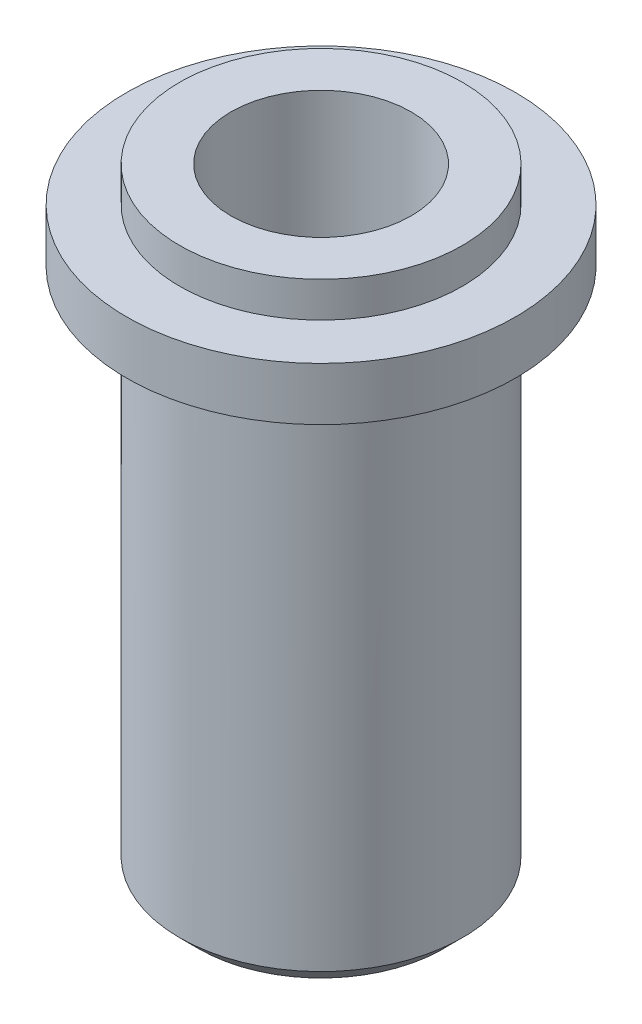
ISO-10303-21;
HEADER;
FILE_DESCRIPTION(('STEP AP214'),'2;1');
FILE_NAME('part.step','',(''),(''),'','','');
FILE_SCHEMA(('AUTOMOTIVE_DESIGN { 1 0 10303 214 1 1 1 1 }'));
ENDSEC;
DATA;
#1=APPLICATION_CONTEXT('core data for automotive mechanical design processes');
#2=APPLICATION_PROTOCOL_DEFINITION('international standard','automotive_design',2000,#1);
#3=PRODUCT_CONTEXT('',#1,'mechanical');
#4=PRODUCT('Part','Part','',(#3));
#5=PRODUCT_RELATED_PRODUCT_CATEGORY('part','',(#4));
#6=PRODUCT_DEFINITION_FORMATION('','',#4);
#7=PRODUCT_DEFINITION_CONTEXT('part definition',#1,'design');
#8=PRODUCT_DEFINITION('design','',#6,#7);
#9=PRODUCT_DEFINITION_SHAPE('','',#8);
#10=(LENGTH_UNIT() NAMED_UNIT(*) SI_UNIT(.MILLI.,.METRE.));
#11=(NAMED_UNIT(*) PLANE_ANGLE_UNIT() SI_UNIT($,.RADIAN.));
#12=(NAMED_UNIT(*) SI_UNIT($,.STERADIAN.) SOLID_ANGLE_UNIT());
#13=UNCERTAINTY_MEASURE_WITH_UNIT(LENGTH_MEASURE(1.E-05),#10,'distance_accuracy_value','');
#14=(GEOMETRIC_REPRESENTATION_CONTEXT(3) GLOBAL_UNCERTAINTY_ASSIGNED_CONTEXT((#13)) GLOBAL_UNIT_ASSIGNED_CONTEXT((#10,
#11,#12)) REPRESENTATION_CONTEXT('',''));
#15=CARTESIAN_POINT('',(0.,0.,0.));
#16=DIRECTION('',(0.,0.,1.));
#17=DIRECTION('',(1.,0.,0.));
#18=AXIS2_PLACEMENT_3D('',#15,#16,#17);
#19=CARTESIAN_POINT('',(8.,0.,0.));
#20=DIRECTION('',(0.,-1.,0.));
#21=DIRECTION('',(0.,0.,-1.));
#22=AXIS2_PLACEMENT_3D('',#19,#20,#21);
#23=PLANE('',#22);
#24=CARTESIAN_POINT('',(0.,0.,0.));
#25=DIRECTION('',(0.,1.,0.));
#26=DIRECTION('',(0.,0.,1.));
#27=AXIS2_PLACEMENT_3D('',#24,#25,#26);
#28=CIRCLE('',#27,5.09999999999999);
#29=CARTESIAN_POINT('',(0.,0.,5.09999999999999));
#30=VERTEX_POINT('',#29);
#31=EDGE_CURVE('E90',#30,#30,#28,.T.);
#32=ORIENTED_EDGE('',*,*,#31,.T.);
#33=EDGE_LOOP('',(#32));
#34=FACE_BOUND('',#33,.T.);
#35=CARTESIAN_POINT('',(0.,0.,0.));
#36=DIRECTION('',(0.,1.,0.));
#37=DIRECTION('',(0.,0.,1.));
#38=AXIS2_PLACEMENT_3D('',#35,#36,#37);
#39=CIRCLE('',#38,6.9175);
#40=CARTESIAN_POINT('',(0.,0.,6.9175));
#41=VERTEX_POINT('',#40);
#42=EDGE_CURVE('E86',#41,#41,#39,.T.);
#43=ORIENTED_EDGE('',*,*,#42,.F.);
#44=EDGE_LOOP('',(#43));
#45=FACE_BOUND('',#44,.T.);
#46=ADVANCED_FACE('F47',(#34,#45),#23,.T.);
#47=CARTESIAN_POINT('',(5.00000000000001,35.,0.));
#48=DIRECTION('',(0.,1.,0.));
#49=DIRECTION('',(0.,0.,1.));
#50=AXIS2_PLACEMENT_3D('',#47,#48,#49);
#51=PLANE('',#50);
#52=CARTESIAN_POINT('',(0.,35.,0.));
#53=DIRECTION('',(0.,1.,0.));
#54=DIRECTION('',(0.,0.,1.));
#55=AXIS2_PLACEMENT_3D('',#52,#53,#54);
#56=CIRCLE('',#55,5.1);
#57=CARTESIAN_POINT('',(0.,35.,5.1));
#58=VERTEX_POINT('',#57);
#59=EDGE_CURVE('E94',#58,#58,#56,.T.);
#60=ORIENTED_EDGE('',*,*,#59,.F.);
#61=EDGE_LOOP('',(#60));
#62=FACE_BOUND('',#61,.T.);
#63=CARTESIAN_POINT('',(0.,35.,0.));
#64=DIRECTION('',(0.,-1.,0.));
#65=DIRECTION('',(0.,0.,-1.));
#66=AXIS2_PLACEMENT_3D('',#63,#64,#65);
#67=CIRCLE('',#66,8.);
#68=CARTESIAN_POINT('',(0.,35.,-8.));
#69=VERTEX_POINT('',#68);
#70=EDGE_CURVE('E10',#69,#69,#67,.T.);
#71=ORIENTED_EDGE('',*,*,#70,.F.);
#72=EDGE_LOOP('',(#71));
#73=FACE_BOUND('',#72,.T.);
#74=ADVANCED_FACE('F101',(#62,#73),#51,.T.);
#75=CARTESIAN_POINT('',(0.,0.,0.));
#76=DIRECTION('',(0.,-1.,0.));
#77=DIRECTION('',(0.,0.,-1.));
#78=AXIS2_PLACEMENT_3D('',#75,#76,#77);
#79=CYLINDRICAL_SURFACE('',#78,8.);
#80=ORIENTED_EDGE('',*,*,#70,.T.);
#81=EDGE_LOOP('',(#80));
#82=FACE_BOUND('',#81,.T.);
#83=CARTESIAN_POINT('',(0.,33.,0.));
#84=DIRECTION('',(0.,-1.,0.));
#85=DIRECTION('',(0.,0.,-1.));
#86=AXIS2_PLACEMENT_3D('',#83,#84,#85);
#87=CIRCLE('',#86,8.);
#88=CARTESIAN_POINT('',(0.,33.,-8.));
#89=VERTEX_POINT('',#88);
#90=EDGE_CURVE('E54',#89,#89,#87,.T.);
#91=ORIENTED_EDGE('',*,*,#90,.F.);
#92=EDGE_LOOP('',(#91));
#93=FACE_BOUND('',#92,.T.);
#94=ADVANCED_FACE('F104',(#82,#93),#79,.T.);
#95=CARTESIAN_POINT('',(8.,33.,0.));
#96=DIRECTION('',(0.,1.,0.));
#97=DIRECTION('',(0.,0.,1.));
#98=AXIS2_PLACEMENT_3D('',#95,#96,#97);
#99=PLANE('',#98);
#100=ORIENTED_EDGE('',*,*,#90,.T.);
#101=EDGE_LOOP('',(#100));
#102=FACE_BOUND('',#101,.T.);
#103=CARTESIAN_POINT('',(0.,33.,0.));
#104=DIRECTION('',(0.,-1.,0.));
#105=DIRECTION('',(0.,0.,-1.));
#106=AXIS2_PLACEMENT_3D('',#103,#104,#105);
#107=CIRCLE('',#106,11.);
#108=CARTESIAN_POINT('',(0.,33.,-11.));
#109=VERTEX_POINT('',#108);
#110=EDGE_CURVE('E59',#109,#109,#107,.T.);
#111=ORIENTED_EDGE('',*,*,#110,.F.);
#112=EDGE_LOOP('',(#111));
#113=FACE_BOUND('',#112,.T.);
#114=ADVANCED_FACE('F109',(#102,#113),#99,.T.);
#115=CARTESIAN_POINT('',(0.,0.,0.));
#116=DIRECTION('',(0.,-1.,0.));
#117=DIRECTION('',(0.,0.,-1.));
#118=AXIS2_PLACEMENT_3D('',#115,#116,#117);
#119=CYLINDRICAL_SURFACE('',#118,11.);
#120=ORIENTED_EDGE('',*,*,#110,.T.);
#121=EDGE_LOOP('',(#120));
#122=FACE_BOUND('',#121,.T.);
#123=CARTESIAN_POINT('',(0.,30.,0.));
#124=DIRECTION('',(0.,-1.,0.));
#125=DIRECTION('',(0.,0.,-1.));
#126=AXIS2_PLACEMENT_3D('',#123,#124,#125);
#127=CIRCLE('',#126,11.);
#128=CARTESIAN_POINT('',(0.,30.,-11.));
#129=VERTEX_POINT('',#128);
#130=EDGE_CURVE('E64',#129,#129,#127,.T.);
#131=ORIENTED_EDGE('',*,*,#130,.F.);
#132=EDGE_LOOP('',(#131));
#133=FACE_BOUND('',#132,.T.);
#134=ADVANCED_FACE('F116',(#122,#133),#119,.T.);
#135=CARTESIAN_POINT('',(11.,30.,0.));
#136=DIRECTION('',(0.,-1.,0.));
#137=DIRECTION('',(0.,0.,-1.));
#138=AXIS2_PLACEMENT_3D('',#135,#136,#137);
#139=PLANE('',#138);
#140=ORIENTED_EDGE('',*,*,#130,.T.);
#141=EDGE_LOOP('',(#140));
#142=FACE_BOUND('',#141,.T.);
#143=CARTESIAN_POINT('',(0.,30.,0.));
#144=DIRECTION('',(0.,-1.,0.));
#145=DIRECTION('',(0.,0.,-1.));
#146=AXIS2_PLACEMENT_3D('',#143,#144,#145);
#147=CIRCLE('',#146,7.);
#148=CARTESIAN_POINT('',(0.,30.,-7.));
#149=VERTEX_POINT('',#148);
#150=EDGE_CURVE('E70',#149,#149,#147,.T.);
#151=ORIENTED_EDGE('',*,*,#150,.F.);
#152=EDGE_LOOP('',(#151));
#153=FACE_BOUND('',#152,.T.);
#154=ADVANCED_FACE('F119',(#142,#153),#139,.T.);
#155=CARTESIAN_POINT('',(0.,0.,0.));
#156=DIRECTION('',(0.,-1.,0.));
#157=DIRECTION('',(0.,0.,-1.));
#158=AXIS2_PLACEMENT_3D('',#155,#156,#157);
#159=CYLINDRICAL_SURFACE('',#158,7.);
#160=ORIENTED_EDGE('',*,*,#150,.T.);
#161=EDGE_LOOP('',(#160));
#162=FACE_BOUND('',#161,.T.);
#163=CARTESIAN_POINT('',(0.,29.,0.));
#164=DIRECTION('',(0.,-1.,0.));
#165=DIRECTION('',(0.,0.,-1.));
#166=AXIS2_PLACEMENT_3D('',#163,#164,#165);
#167=CIRCLE('',#166,7.);
#168=CARTESIAN_POINT('',(0.,29.,-7.));
#169=VERTEX_POINT('',#168);
#170=EDGE_CURVE('E74',#169,#169,#167,.T.);
#171=ORIENTED_EDGE('',*,*,#170,.F.);
#172=EDGE_LOOP('',(#171));
#173=FACE_BOUND('',#172,.T.);
#174=ADVANCED_FACE('F123',(#162,#173),#159,.T.);
#175=CARTESIAN_POINT('',(8.,29.,0.));
#176=DIRECTION('',(0.,1.,0.));
#177=DIRECTION('',(0.,0.,1.));
#178=AXIS2_PLACEMENT_3D('',#175,#176,#177);
#179=PLANE('',#178);
#180=ORIENTED_EDGE('',*,*,#170,.T.);
#181=EDGE_LOOP('',(#180));
#182=FACE_BOUND('',#181,.T.);
#183=CARTESIAN_POINT('',(0.,29.,0.));
#184=DIRECTION('',(0.,-1.,0.));
#185=DIRECTION('',(0.,0.,-1.));
#186=AXIS2_PLACEMENT_3D('',#183,#184,#185);
#187=CIRCLE('',#186,8.);
#188=CARTESIAN_POINT('',(0.,29.,-8.));
#189=VERTEX_POINT('',#188);
#190=EDGE_CURVE('E78',#189,#189,#187,.T.);
#191=ORIENTED_EDGE('',*,*,#190,.F.);
#192=EDGE_LOOP('',(#191));
#193=FACE_BOUND('',#192,.T.);
#194=ADVANCED_FACE('F127',(#182,#193),#179,.T.);
#195=CARTESIAN_POINT('',(0.,0.,0.));
#196=DIRECTION('',(0.,-1.,0.));
#197=DIRECTION('',(0.,0.,-1.));
#198=AXIS2_PLACEMENT_3D('',#195,#196,#197);
#199=CYLINDRICAL_SURFACE('',#198,8.);
#200=CARTESIAN_POINT('',(0.,1.08249999999999,0.));
#201=DIRECTION('',(0.,1.,0.));
#202=DIRECTION('',(0.,0.,1.));
#203=AXIS2_PLACEMENT_3D('',#200,#201,#202);
#204=CIRCLE('',#203,8.);
#205=CARTESIAN_POINT('',(0.,1.08249999999999,8.));
#206=VERTEX_POINT('',#205);
#207=EDGE_CURVE('E82',#206,#206,#204,.T.);
#208=ORIENTED_EDGE('',*,*,#207,.T.);
#209=EDGE_LOOP('',(#208));
#210=FACE_BOUND('',#209,.T.);
#211=ORIENTED_EDGE('',*,*,#190,.T.);
#212=EDGE_LOOP('',(#211));
#213=FACE_BOUND('',#212,.T.);
#214=ADVANCED_FACE('F131',(#210,#213),#199,.T.);
#215=CARTESIAN_POINT('',(0.,0.,0.));
#216=DIRECTION('',(0.,1.,0.));
#217=DIRECTION('',(0.,0.,1.));
#218=AXIS2_PLACEMENT_3D('',#215,#216,#217);
#219=CONICAL_SURFACE('',#218,6.9175,0.785398163397454);
#220=ORIENTED_EDGE('',*,*,#207,.F.);
#221=EDGE_LOOP('',(#220));
#222=FACE_BOUND('',#221,.T.);
#223=ORIENTED_EDGE('',*,*,#42,.T.);
#224=EDGE_LOOP('',(#223));
#225=FACE_BOUND('',#224,.T.);
#226=ADVANCED_FACE('F135',(#222,#225),#219,.T.);
#227=CARTESIAN_POINT('',(0.,35.,0.));
#228=DIRECTION('',(0.,1.,0.));
#229=DIRECTION('',(0.,0.,1.));
#230=AXIS2_PLACEMENT_3D('',#227,#228,#229);
#231=CYLINDRICAL_SURFACE('',#230,5.09999999999999);
#232=ORIENTED_EDGE('',*,*,#31,.F.);
#233=EDGE_LOOP('',(#232));
#234=FACE_BOUND('',#233,.T.);
#235=ORIENTED_EDGE('',*,*,#59,.T.);
#236=EDGE_LOOP('',(#235));
#237=FACE_BOUND('',#236,.T.);
#238=ADVANCED_FACE('F99',(#234,#237),#231,.F.);
#239=CLOSED_SHELL('',(#46,#74,#94,#114,#134,#154,#174,#194,#214,#226,#238));
#240=MANIFOLD_SOLID_BREP('B2',#239);
#241=ADVANCED_BREP_SHAPE_REPRESENTATION('',(#18,#240),#14);
#242=SHAPE_DEFINITION_REPRESENTATION(#9,#241);
ENDSEC;
END-ISO-10303-21;
